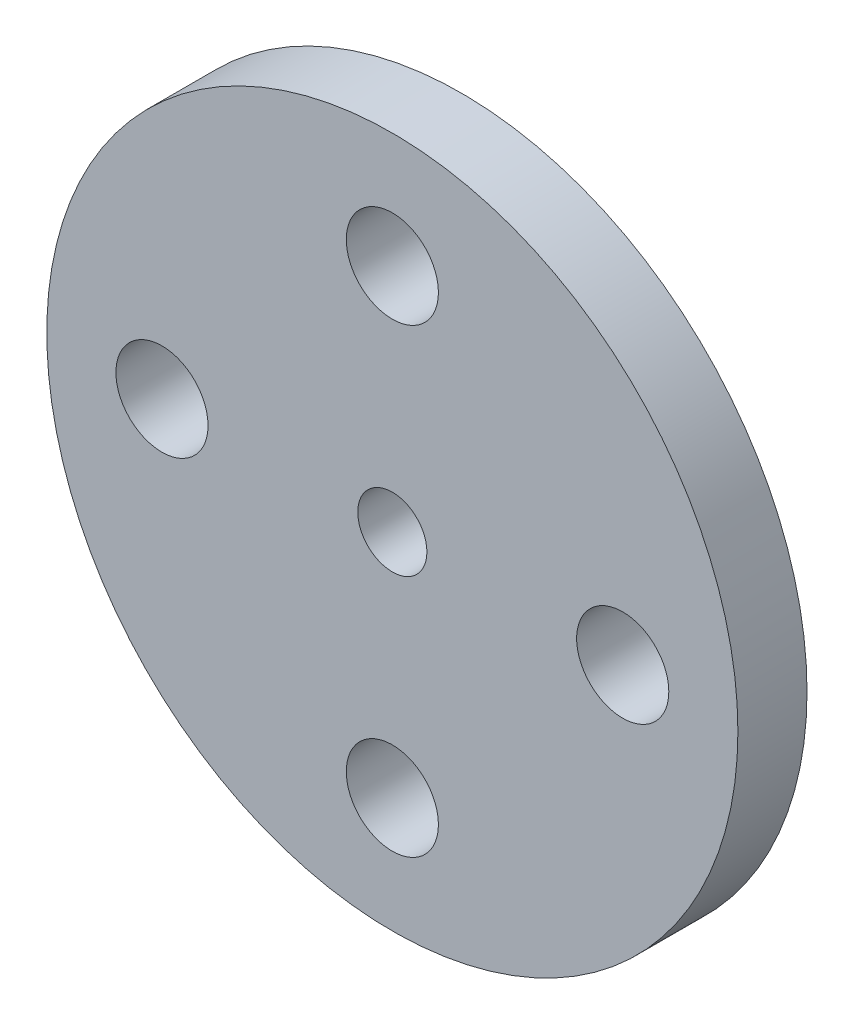
ISO-10303-21;
HEADER;
FILE_DESCRIPTION(('STEP AP214'),'2;1');
FILE_NAME('part.step','',(''),(''),'','','');
FILE_SCHEMA(('AUTOMOTIVE_DESIGN { 1 0 10303 214 1 1 1 1 }'));
ENDSEC;
DATA;
#1=APPLICATION_CONTEXT('core data for automotive mechanical design processes');
#2=APPLICATION_PROTOCOL_DEFINITION('international standard','automotive_design',2000,#1);
#3=PRODUCT_CONTEXT('',#1,'mechanical');
#4=PRODUCT('Part','Part','',(#3));
#5=PRODUCT_RELATED_PRODUCT_CATEGORY('part','',(#4));
#6=PRODUCT_DEFINITION_FORMATION('','',#4);
#7=PRODUCT_DEFINITION_CONTEXT('part definition',#1,'design');
#8=PRODUCT_DEFINITION('design','',#6,#7);
#9=PRODUCT_DEFINITION_SHAPE('','',#8);
#10=(LENGTH_UNIT() NAMED_UNIT(*) SI_UNIT(.MILLI.,.METRE.));
#11=(NAMED_UNIT(*) PLANE_ANGLE_UNIT() SI_UNIT($,.RADIAN.));
#12=(NAMED_UNIT(*) SI_UNIT($,.STERADIAN.) SOLID_ANGLE_UNIT());
#13=UNCERTAINTY_MEASURE_WITH_UNIT(LENGTH_MEASURE(1.E-05),#10,'distance_accuracy_value','');
#14=(GEOMETRIC_REPRESENTATION_CONTEXT(3) GLOBAL_UNCERTAINTY_ASSIGNED_CONTEXT((#13)) GLOBAL_UNIT_ASSIGNED_CONTEXT((#10,
#11,#12)) REPRESENTATION_CONTEXT('',''));
#15=CARTESIAN_POINT('',(0.,0.,0.));
#16=DIRECTION('',(0.,0.,1.));
#17=DIRECTION('',(1.,0.,0.));
#18=AXIS2_PLACEMENT_3D('',#15,#16,#17);
#19=CARTESIAN_POINT('',(0.,0.,0.));
#20=DIRECTION('',(0.,0.,1.));
#21=DIRECTION('',(1.,0.,0.));
#22=AXIS2_PLACEMENT_3D('',#19,#20,#21);
#23=PLANE('',#22);
#24=CARTESIAN_POINT('',(0.,0.,0.));
#25=DIRECTION('',(0.,0.,1.));
#26=DIRECTION('',(1.,0.,0.));
#27=AXIS2_PLACEMENT_3D('',#24,#25,#26);
#28=CIRCLE('',#27,4.5);
#29=CARTESIAN_POINT('',(4.5,0.,0.));
#30=VERTEX_POINT('',#29);
#31=EDGE_CURVE('E35',#30,#30,#28,.T.);
#32=ORIENTED_EDGE('',*,*,#31,.F.);
#33=EDGE_LOOP('',(#32));
#34=FACE_BOUND('',#33,.T.);
#35=CARTESIAN_POINT('',(0.,0.,0.));
#36=DIRECTION('',(0.,0.,1.));
#37=DIRECTION('',(1.,0.,0.));
#38=AXIS2_PLACEMENT_3D('',#35,#36,#37);
#39=CIRCLE('',#38,3.5);
#40=CARTESIAN_POINT('',(3.5,0.,0.));
#41=VERTEX_POINT('',#40);
#42=EDGE_CURVE('E42',#41,#41,#39,.T.);
#43=ORIENTED_EDGE('',*,*,#42,.T.);
#44=EDGE_LOOP('',(#43));
#45=FACE_BOUND('',#44,.T.);
#46=ADVANCED_FACE('F31',(#34,#45),#23,.F.);
#47=CARTESIAN_POINT('',(0.,0.,5.));
#48=DIRECTION('',(0.,0.,-1.));
#49=DIRECTION('',(-1.,0.,0.));
#50=AXIS2_PLACEMENT_3D('',#47,#48,#49);
#51=CYLINDRICAL_SURFACE('',#50,4.5);
#52=CARTESIAN_POINT('',(0.,0.,5.));
#53=DIRECTION('',(0.,0.,1.));
#54=DIRECTION('',(1.,0.,0.));
#55=AXIS2_PLACEMENT_3D('',#52,#53,#54);
#56=CIRCLE('',#55,4.5);
#57=CARTESIAN_POINT('',(4.5,0.,5.));
#58=VERTEX_POINT('',#57);
#59=EDGE_CURVE('E10',#58,#58,#56,.T.);
#60=ORIENTED_EDGE('',*,*,#59,.F.);
#61=EDGE_LOOP('',(#60));
#62=FACE_BOUND('',#61,.T.);
#63=ORIENTED_EDGE('',*,*,#31,.T.);
#64=EDGE_LOOP('',(#63));
#65=FACE_BOUND('',#64,.T.);
#66=ADVANCED_FACE('F33',(#62,#65),#51,.T.);
#67=CARTESIAN_POINT('',(0.,0.,5.));
#68=DIRECTION('',(0.,0.,-1.));
#69=DIRECTION('',(-1.,0.,0.));
#70=AXIS2_PLACEMENT_3D('',#67,#68,#69);
#71=CYLINDRICAL_SURFACE('',#70,3.5);
#72=CARTESIAN_POINT('',(0.,0.,5.));
#73=DIRECTION('',(0.,0.,1.));
#74=DIRECTION('',(1.,0.,0.));
#75=AXIS2_PLACEMENT_3D('',#72,#73,#74);
#76=CIRCLE('',#75,3.5);
#77=CARTESIAN_POINT('',(3.5,0.,5.));
#78=VERTEX_POINT('',#77);
#79=EDGE_CURVE('E46',#78,#78,#76,.T.);
#80=ORIENTED_EDGE('',*,*,#79,.T.);
#81=EDGE_LOOP('',(#80));
#82=FACE_BOUND('',#81,.T.);
#83=ORIENTED_EDGE('',*,*,#42,.F.);
#84=EDGE_LOOP('',(#83));
#85=FACE_BOUND('',#84,.T.);
#86=ADVANCED_FACE('F101',(#82,#85),#71,.F.);
#87=CARTESIAN_POINT('',(0.,0.,5.));
#88=DIRECTION('',(0.,0.,1.));
#89=DIRECTION('',(1.,0.,0.));
#90=AXIS2_PLACEMENT_3D('',#87,#88,#89);
#91=PLANE('',#90);
#92=CARTESIAN_POINT('',(0.,0.,5.));
#93=DIRECTION('',(0.,0.,1.));
#94=DIRECTION('',(1.,0.,0.));
#95=AXIS2_PLACEMENT_3D('',#92,#93,#94);
#96=CIRCLE('',#95,1.5);
#97=CARTESIAN_POINT('',(1.5,0.,5.));
#98=VERTEX_POINT('',#97);
#99=EDGE_CURVE('E56',#98,#98,#96,.T.);
#100=ORIENTED_EDGE('',*,*,#99,.T.);
#101=EDGE_LOOP('',(#100));
#102=FACE_BOUND('',#101,.T.);
#103=ORIENTED_EDGE('',*,*,#79,.F.);
#104=EDGE_LOOP('',(#103));
#105=FACE_BOUND('',#104,.T.);
#106=ADVANCED_FACE('F92',(#102,#105),#91,.F.);
#107=CARTESIAN_POINT('',(0.,0.,8.));
#108=DIRECTION('',(0.,0.,1.));
#109=DIRECTION('',(1.,0.,0.));
#110=AXIS2_PLACEMENT_3D('',#107,#108,#109);
#111=PLANE('',#110);
#112=CARTESIAN_POINT('',(5.64760248210638E-13,-10.,8.));
#113=DIRECTION('',(0.,0.,1.));
#114=DIRECTION('',(1.,0.,0.));
#115=AXIS2_PLACEMENT_3D('',#112,#113,#114);
#116=CIRCLE('',#115,2.00000000000061);
#117=CARTESIAN_POINT('',(2.00000000000117,-10.,8.));
#118=VERTEX_POINT('',#117);
#119=EDGE_CURVE('E71',#118,#118,#116,.T.);
#120=ORIENTED_EDGE('',*,*,#119,.F.);
#121=EDGE_LOOP('',(#120));
#122=FACE_BOUND('',#121,.T.);
#123=CARTESIAN_POINT('',(0.,10.,8.));
#124=DIRECTION('',(0.,0.,1.));
#125=DIRECTION('',(1.,0.,0.));
#126=AXIS2_PLACEMENT_3D('',#123,#124,#125);
#127=CIRCLE('',#126,2.);
#128=CARTESIAN_POINT('',(2.,10.,8.));
#129=VERTEX_POINT('',#128);
#130=EDGE_CURVE('E59',#129,#129,#127,.T.);
#131=ORIENTED_EDGE('',*,*,#130,.F.);
#132=EDGE_LOOP('',(#131));
#133=FACE_BOUND('',#132,.T.);
#134=CARTESIAN_POINT('',(0.,0.,8.));
#135=DIRECTION('',(0.,0.,1.));
#136=DIRECTION('',(1.,0.,0.));
#137=AXIS2_PLACEMENT_3D('',#134,#135,#136);
#138=CIRCLE('',#137,15.);
#139=CARTESIAN_POINT('',(15.,0.,8.));
#140=VERTEX_POINT('',#139);
#141=EDGE_CURVE('E49',#140,#140,#138,.T.);
#142=ORIENTED_EDGE('',*,*,#141,.T.);
#143=EDGE_LOOP('',(#142));
#144=FACE_BOUND('',#143,.T.);
#145=CARTESIAN_POINT('',(0.,0.,8.));
#146=DIRECTION('',(0.,0.,1.));
#147=DIRECTION('',(1.,0.,0.));
#148=AXIS2_PLACEMENT_3D('',#145,#146,#147);
#149=CIRCLE('',#148,1.5);
#150=CARTESIAN_POINT('',(1.5,0.,8.));
#151=VERTEX_POINT('',#150);
#152=EDGE_CURVE('E53',#151,#151,#149,.T.);
#153=ORIENTED_EDGE('',*,*,#152,.F.);
#154=EDGE_LOOP('',(#153));
#155=FACE_BOUND('',#154,.T.);
#156=CARTESIAN_POINT('',(10.0000000000003,2.82380124105319E-13,8.));
#157=DIRECTION('',(0.,0.,1.));
#158=DIRECTION('',(1.,0.,0.));
#159=AXIS2_PLACEMENT_3D('',#156,#157,#158);
#160=CIRCLE('',#159,2.00000000000022);
#161=CARTESIAN_POINT('',(12.0000000000005,2.82380124105319E-13,8.));
#162=VERTEX_POINT('',#161);
#163=EDGE_CURVE('E65',#162,#162,#160,.T.);
#164=ORIENTED_EDGE('',*,*,#163,.F.);
#165=EDGE_LOOP('',(#164));
#166=FACE_BOUND('',#165,.T.);
#167=CARTESIAN_POINT('',(-9.99999999999972,-2.83604770904466E-13,8.));
#168=DIRECTION('',(0.,0.,1.));
#169=DIRECTION('',(1.,0.,0.));
#170=AXIS2_PLACEMENT_3D('',#167,#168,#169);
#171=CIRCLE('',#170,2.00000000000045);
#172=CARTESIAN_POINT('',(-7.99999999999927,-2.83604770904466E-13,8.));
#173=VERTEX_POINT('',#172);
#174=EDGE_CURVE('E77',#173,#173,#171,.T.);
#175=ORIENTED_EDGE('',*,*,#174,.F.);
#176=EDGE_LOOP('',(#175));
#177=FACE_BOUND('',#176,.T.);
#178=ADVANCED_FACE('F89',(#122,#133,#144,#155,#166,#177),#111,.T.);
#179=ORIENTED_EDGE('',*,*,#59,.T.);
#180=EDGE_LOOP('',(#179));
#181=FACE_BOUND('',#180,.T.);
#182=CARTESIAN_POINT('',(0.,0.,5.));
#183=DIRECTION('',(0.,0.,1.));
#184=DIRECTION('',(1.,0.,0.));
#185=AXIS2_PLACEMENT_3D('',#182,#183,#184);
#186=CIRCLE('',#185,15.);
#187=CARTESIAN_POINT('',(15.,0.,5.));
#188=VERTEX_POINT('',#187);
#189=EDGE_CURVE('E50',#188,#188,#186,.T.);
#190=ORIENTED_EDGE('',*,*,#189,.F.);
#191=EDGE_LOOP('',(#190));
#192=FACE_BOUND('',#191,.T.);
#193=CARTESIAN_POINT('',(0.,10.,5.));
#194=DIRECTION('',(0.,0.,1.));
#195=DIRECTION('',(1.,0.,0.));
#196=AXIS2_PLACEMENT_3D('',#193,#194,#195);
#197=CIRCLE('',#196,2.);
#198=CARTESIAN_POINT('',(2.,10.,5.));
#199=VERTEX_POINT('',#198);
#200=EDGE_CURVE('E62',#199,#199,#197,.T.);
#201=ORIENTED_EDGE('',*,*,#200,.T.);
#202=EDGE_LOOP('',(#201));
#203=FACE_BOUND('',#202,.T.);
#204=CARTESIAN_POINT('',(10.0000000000003,2.82380124105319E-13,5.));
#205=DIRECTION('',(0.,0.,1.));
#206=DIRECTION('',(1.,0.,0.));
#207=AXIS2_PLACEMENT_3D('',#204,#205,#206);
#208=CIRCLE('',#207,2.00000000000022);
#209=CARTESIAN_POINT('',(12.0000000000005,2.82380124105319E-13,5.));
#210=VERTEX_POINT('',#209);
#211=EDGE_CURVE('E68',#210,#210,#208,.T.);
#212=ORIENTED_EDGE('',*,*,#211,.T.);
#213=EDGE_LOOP('',(#212));
#214=FACE_BOUND('',#213,.T.);
#215=CARTESIAN_POINT('',(5.64760248210638E-13,-10.,5.));
#216=DIRECTION('',(0.,0.,1.));
#217=DIRECTION('',(1.,0.,0.));
#218=AXIS2_PLACEMENT_3D('',#215,#216,#217);
#219=CIRCLE('',#218,2.00000000000061);
#220=CARTESIAN_POINT('',(2.00000000000117,-10.,5.));
#221=VERTEX_POINT('',#220);
#222=EDGE_CURVE('E74',#221,#221,#219,.T.);
#223=ORIENTED_EDGE('',*,*,#222,.T.);
#224=EDGE_LOOP('',(#223));
#225=FACE_BOUND('',#224,.T.);
#226=CARTESIAN_POINT('',(-9.99999999999972,-2.83604770904466E-13,5.));
#227=DIRECTION('',(0.,0.,1.));
#228=DIRECTION('',(1.,0.,0.));
#229=AXIS2_PLACEMENT_3D('',#226,#227,#228);
#230=CIRCLE('',#229,2.00000000000045);
#231=CARTESIAN_POINT('',(-7.99999999999927,-2.83604770904466E-13,5.));
#232=VERTEX_POINT('',#231);
#233=EDGE_CURVE('E80',#232,#232,#230,.T.);
#234=ORIENTED_EDGE('',*,*,#233,.T.);
#235=EDGE_LOOP('',(#234));
#236=FACE_BOUND('',#235,.T.);
#237=ADVANCED_FACE('F91',(#181,#192,#203,#214,#225,#236),#91,.F.);
#238=CARTESIAN_POINT('',(0.,0.,8.));
#239=DIRECTION('',(0.,0.,-1.));
#240=DIRECTION('',(-1.,0.,0.));
#241=AXIS2_PLACEMENT_3D('',#238,#239,#240);
#242=CYLINDRICAL_SURFACE('',#241,15.);
#243=ORIENTED_EDGE('',*,*,#141,.F.);
#244=EDGE_LOOP('',(#243));
#245=FACE_BOUND('',#244,.T.);
#246=ORIENTED_EDGE('',*,*,#189,.T.);
#247=EDGE_LOOP('',(#246));
#248=FACE_BOUND('',#247,.T.);
#249=ADVANCED_FACE('F99',(#245,#248),#242,.T.);
#250=CARTESIAN_POINT('',(0.,0.,8.));
#251=DIRECTION('',(0.,0.,-1.));
#252=DIRECTION('',(-1.,0.,0.));
#253=AXIS2_PLACEMENT_3D('',#250,#251,#252);
#254=CYLINDRICAL_SURFACE('',#253,1.5);
#255=ORIENTED_EDGE('',*,*,#152,.T.);
#256=EDGE_LOOP('',(#255));
#257=FACE_BOUND('',#256,.T.);
#258=ORIENTED_EDGE('',*,*,#99,.F.);
#259=EDGE_LOOP('',(#258));
#260=FACE_BOUND('',#259,.T.);
#261=ADVANCED_FACE('F119',(#257,#260),#254,.F.);
#262=CARTESIAN_POINT('',(0.,10.,8.));
#263=DIRECTION('',(0.,0.,-1.));
#264=DIRECTION('',(-1.,0.,0.));
#265=AXIS2_PLACEMENT_3D('',#262,#263,#264);
#266=CYLINDRICAL_SURFACE('',#265,2.);
#267=ORIENTED_EDGE('',*,*,#130,.T.);
#268=EDGE_LOOP('',(#267));
#269=FACE_BOUND('',#268,.T.);
#270=ORIENTED_EDGE('',*,*,#200,.F.);
#271=EDGE_LOOP('',(#270));
#272=FACE_BOUND('',#271,.T.);
#273=ADVANCED_FACE('F124',(#269,#272),#266,.F.);
#274=CARTESIAN_POINT('',(10.0000000000003,2.82380124105319E-13,8.));
#275=DIRECTION('',(0.,0.,-1.));
#276=DIRECTION('',(-1.,0.,0.));
#277=AXIS2_PLACEMENT_3D('',#274,#275,#276);
#278=CYLINDRICAL_SURFACE('',#277,2.00000000000022);
#279=ORIENTED_EDGE('',*,*,#163,.T.);
#280=EDGE_LOOP('',(#279));
#281=FACE_BOUND('',#280,.T.);
#282=ORIENTED_EDGE('',*,*,#211,.F.);
#283=EDGE_LOOP('',(#282));
#284=FACE_BOUND('',#283,.T.);
#285=ADVANCED_FACE('F144',(#281,#284),#278,.F.);
#286=CARTESIAN_POINT('',(5.64760248210638E-13,-10.,8.));
#287=DIRECTION('',(0.,0.,-1.));
#288=DIRECTION('',(-1.,0.,0.));
#289=AXIS2_PLACEMENT_3D('',#286,#287,#288);
#290=CYLINDRICAL_SURFACE('',#289,2.00000000000061);
#291=ORIENTED_EDGE('',*,*,#119,.T.);
#292=EDGE_LOOP('',(#291));
#293=FACE_BOUND('',#292,.T.);
#294=ORIENTED_EDGE('',*,*,#222,.F.);
#295=EDGE_LOOP('',(#294));
#296=FACE_BOUND('',#295,.T.);
#297=ADVANCED_FACE('F139',(#293,#296),#290,.F.);
#298=CARTESIAN_POINT('',(-9.99999999999972,-2.83604770904466E-13,8.));
#299=DIRECTION('',(0.,0.,-1.));
#300=DIRECTION('',(-1.,0.,0.));
#301=AXIS2_PLACEMENT_3D('',#298,#299,#300);
#302=CYLINDRICAL_SURFACE('',#301,2.00000000000045);
#303=ORIENTED_EDGE('',*,*,#174,.T.);
#304=EDGE_LOOP('',(#303));
#305=FACE_BOUND('',#304,.T.);
#306=ORIENTED_EDGE('',*,*,#233,.F.);
#307=EDGE_LOOP('',(#306));
#308=FACE_BOUND('',#307,.T.);
#309=ADVANCED_FACE('F86',(#305,#308),#302,.F.);
#310=CLOSED_SHELL('',(#46,#66,#86,#106,#178,#237,#249,#261,#273,#285,#297,#309));
#311=MANIFOLD_SOLID_BREP('B2',#310);
#312=ADVANCED_BREP_SHAPE_REPRESENTATION('',(#18,#311),#14);
#313=SHAPE_DEFINITION_REPRESENTATION(#9,#312);
ENDSEC;
END-ISO-10303-21;
